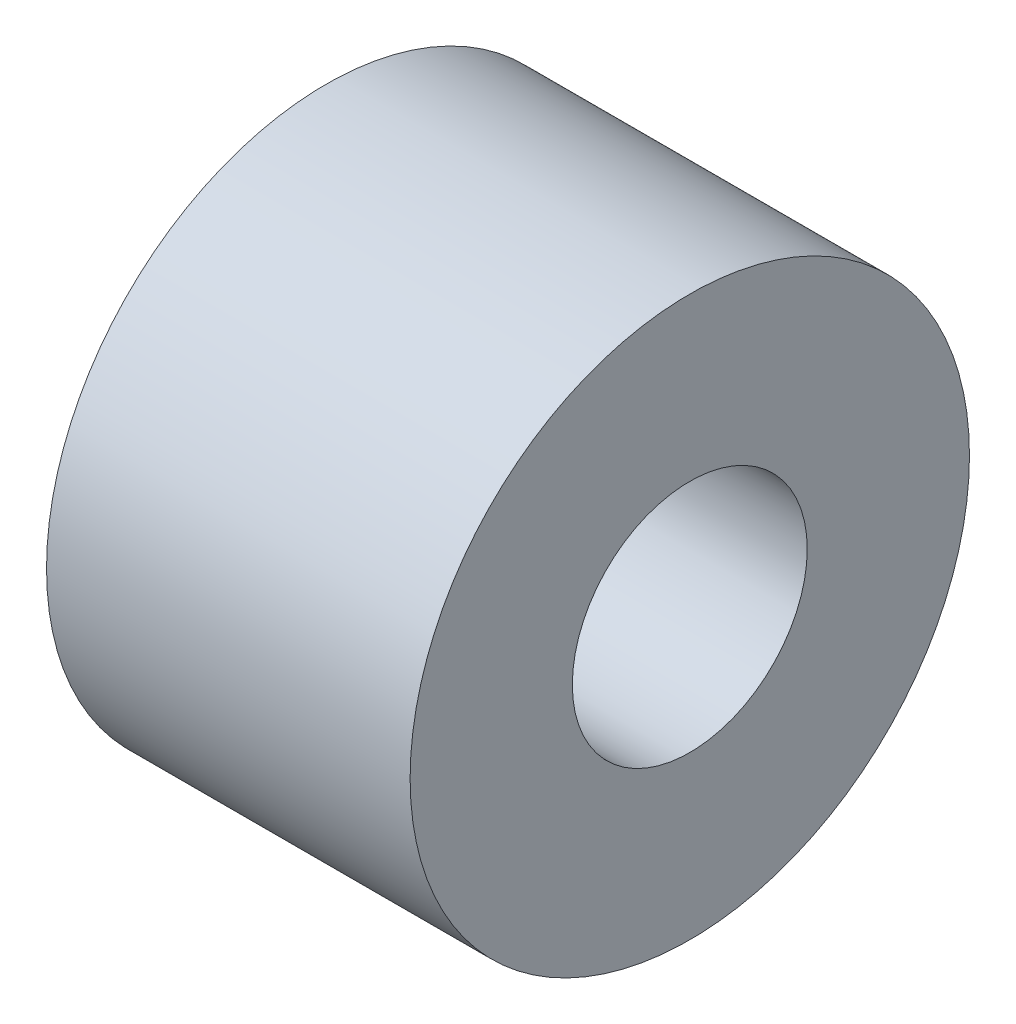
ISO-10303-21;
HEADER;
FILE_DESCRIPTION(('STEP AP214'),'2;1');
FILE_NAME('part.step','',(''),(''),'','','');
FILE_SCHEMA(('AUTOMOTIVE_DESIGN { 1 0 10303 214 1 1 1 1 }'));
ENDSEC;
DATA;
#1=APPLICATION_CONTEXT('core data for automotive mechanical design processes');
#2=APPLICATION_PROTOCOL_DEFINITION('international standard','automotive_design',2000,#1);
#3=PRODUCT_CONTEXT('',#1,'mechanical');
#4=PRODUCT('Part','Part','',(#3));
#5=PRODUCT_RELATED_PRODUCT_CATEGORY('part','',(#4));
#6=PRODUCT_DEFINITION_FORMATION('','',#4);
#7=PRODUCT_DEFINITION_CONTEXT('part definition',#1,'design');
#8=PRODUCT_DEFINITION('design','',#6,#7);
#9=PRODUCT_DEFINITION_SHAPE('','',#8);
#10=(LENGTH_UNIT() NAMED_UNIT(*) SI_UNIT(.MILLI.,.METRE.));
#11=(NAMED_UNIT(*) PLANE_ANGLE_UNIT() SI_UNIT($,.RADIAN.));
#12=(NAMED_UNIT(*) SI_UNIT($,.STERADIAN.) SOLID_ANGLE_UNIT());
#13=UNCERTAINTY_MEASURE_WITH_UNIT(LENGTH_MEASURE(1.E-05),#10,'distance_accuracy_value','');
#14=(GEOMETRIC_REPRESENTATION_CONTEXT(3) GLOBAL_UNCERTAINTY_ASSIGNED_CONTEXT((#13)) GLOBAL_UNIT_ASSIGNED_CONTEXT((#10,
#11,#12)) REPRESENTATION_CONTEXT('',''));
#15=CARTESIAN_POINT('',(0.,0.,0.));
#16=DIRECTION('',(0.,0.,1.));
#17=DIRECTION('',(1.,0.,0.));
#18=AXIS2_PLACEMENT_3D('',#15,#16,#17);
#19=CARTESIAN_POINT('',(13.,0.,0.));
#20=DIRECTION('',(1.,0.,0.));
#21=DIRECTION('',(0.,0.,-1.));
#22=AXIS2_PLACEMENT_3D('',#19,#20,#21);
#23=PLANE('',#22);
#24=CARTESIAN_POINT('',(13.,0.,0.));
#25=DIRECTION('',(1.,0.,0.));
#26=DIRECTION('',(0.,0.,-1.));
#27=AXIS2_PLACEMENT_3D('',#24,#25,#26);
#28=CIRCLE('',#27,10.);
#29=CARTESIAN_POINT('',(13.,0.,10.));
#30=VERTEX_POINT('',#29);
#31=EDGE_CURVE('E10',#30,#30,#28,.T.);
#32=ORIENTED_EDGE('',*,*,#31,.T.);
#33=EDGE_LOOP('',(#32));
#34=FACE_BOUND('',#33,.T.);
#35=CARTESIAN_POINT('',(13.,0.,0.));
#36=DIRECTION('',(1.,0.,0.));
#37=DIRECTION('',(0.,0.,-1.));
#38=AXIS2_PLACEMENT_3D('',#35,#36,#37);
#39=CIRCLE('',#38,4.2);
#40=CARTESIAN_POINT('',(13.,0.,4.2));
#41=VERTEX_POINT('',#40);
#42=EDGE_CURVE('E42',#41,#41,#39,.T.);
#43=ORIENTED_EDGE('',*,*,#42,.F.);
#44=EDGE_LOOP('',(#43));
#45=FACE_BOUND('',#44,.T.);
#46=ADVANCED_FACE('F31',(#34,#45),#23,.T.);
#47=CARTESIAN_POINT('',(0.,0.,0.));
#48=DIRECTION('',(1.,0.,0.));
#49=DIRECTION('',(0.,0.,-1.));
#50=AXIS2_PLACEMENT_3D('',#47,#48,#49);
#51=PLANE('',#50);
#52=CARTESIAN_POINT('',(0.,0.,0.));
#53=DIRECTION('',(1.,0.,0.));
#54=DIRECTION('',(0.,0.,-1.));
#55=AXIS2_PLACEMENT_3D('',#52,#53,#54);
#56=CIRCLE('',#55,10.);
#57=CARTESIAN_POINT('',(0.,0.,10.));
#58=VERTEX_POINT('',#57);
#59=EDGE_CURVE('E35',#58,#58,#56,.T.);
#60=ORIENTED_EDGE('',*,*,#59,.F.);
#61=EDGE_LOOP('',(#60));
#62=FACE_BOUND('',#61,.T.);
#63=CARTESIAN_POINT('',(0.,0.,0.));
#64=DIRECTION('',(1.,0.,0.));
#65=DIRECTION('',(0.,0.,-1.));
#66=AXIS2_PLACEMENT_3D('',#63,#64,#65);
#67=CIRCLE('',#66,4.2);
#68=CARTESIAN_POINT('',(0.,0.,4.2));
#69=VERTEX_POINT('',#68);
#70=EDGE_CURVE('E44',#69,#69,#67,.T.);
#71=ORIENTED_EDGE('',*,*,#70,.T.);
#72=EDGE_LOOP('',(#71));
#73=FACE_BOUND('',#72,.T.);
#74=ADVANCED_FACE('F54',(#62,#73),#51,.F.);
#75=CARTESIAN_POINT('',(13.,0.,0.));
#76=DIRECTION('',(-1.,0.,0.));
#77=DIRECTION('',(0.,0.,1.));
#78=AXIS2_PLACEMENT_3D('',#75,#76,#77);
#79=CYLINDRICAL_SURFACE('',#78,10.);
#80=CARTESIAN_POINT('',(13.,0.,10.));
#81=CARTESIAN_POINT('',(12.8645833333333,0.,10.));
#82=CARTESIAN_POINT('',(12.7291666666667,0.,10.));
#83=CARTESIAN_POINT('',(12.4583333333333,0.,10.));
#84=CARTESIAN_POINT('',(12.3229166666667,0.,10.));
#85=CARTESIAN_POINT('',(12.0520833333333,0.,10.));
#86=CARTESIAN_POINT('',(11.9166666666667,0.,10.));
#87=CARTESIAN_POINT('',(11.6458333333333,0.,10.));
#88=CARTESIAN_POINT('',(11.5104166666667,0.,10.));
#89=CARTESIAN_POINT('',(11.2395833333333,0.,10.));
#90=CARTESIAN_POINT('',(11.1041666666667,0.,10.));
#91=CARTESIAN_POINT('',(10.8333333333333,0.,10.));
#92=CARTESIAN_POINT('',(10.6979166666667,0.,10.));
#93=CARTESIAN_POINT('',(10.4270833333333,0.,10.));
#94=CARTESIAN_POINT('',(10.2916666666667,0.,10.));
#95=CARTESIAN_POINT('',(10.0208333333333,0.,10.));
#96=CARTESIAN_POINT('',(9.88541666666667,0.,10.));
#97=CARTESIAN_POINT('',(9.61458333333333,0.,10.));
#98=CARTESIAN_POINT('',(9.47916666666667,0.,10.));
#99=CARTESIAN_POINT('',(9.20833333333333,0.,10.));
#100=CARTESIAN_POINT('',(9.07291666666666,0.,10.));
#101=CARTESIAN_POINT('',(8.80208333333333,0.,10.));
#102=CARTESIAN_POINT('',(8.66666666666667,0.,10.));
#103=CARTESIAN_POINT('',(8.39583333333333,0.,10.));
#104=CARTESIAN_POINT('',(8.26041666666667,0.,10.));
#105=CARTESIAN_POINT('',(7.98958333333333,0.,10.));
#106=CARTESIAN_POINT('',(7.85416666666667,0.,10.));
#107=CARTESIAN_POINT('',(7.58333333333333,0.,10.));
#108=CARTESIAN_POINT('',(7.44791666666667,0.,10.));
#109=CARTESIAN_POINT('',(7.17708333333333,0.,10.));
#110=CARTESIAN_POINT('',(7.04166666666667,0.,10.));
#111=CARTESIAN_POINT('',(6.77083333333333,0.,10.));
#112=CARTESIAN_POINT('',(6.63541666666667,0.,10.));
#113=CARTESIAN_POINT('',(6.36458333333333,0.,10.));
#114=CARTESIAN_POINT('',(6.22916666666667,0.,10.));
#115=CARTESIAN_POINT('',(5.95833333333333,0.,10.));
#116=CARTESIAN_POINT('',(5.82291666666667,0.,10.));
#117=CARTESIAN_POINT('',(5.55208333333333,0.,10.));
#118=CARTESIAN_POINT('',(5.41666666666667,0.,10.));
#119=CARTESIAN_POINT('',(5.14583333333333,0.,10.));
#120=CARTESIAN_POINT('',(5.01041666666667,0.,10.));
#121=CARTESIAN_POINT('',(4.73958333333333,0.,10.));
#122=CARTESIAN_POINT('',(4.60416666666667,0.,10.));
#123=CARTESIAN_POINT('',(4.33333333333333,0.,10.));
#124=CARTESIAN_POINT('',(4.19791666666667,0.,10.));
#125=CARTESIAN_POINT('',(3.92708333333333,0.,10.));
#126=CARTESIAN_POINT('',(3.79166666666667,0.,10.));
#127=CARTESIAN_POINT('',(3.52083333333333,0.,10.));
#128=CARTESIAN_POINT('',(3.38541666666667,0.,10.));
#129=CARTESIAN_POINT('',(3.11458333333333,0.,10.));
#130=CARTESIAN_POINT('',(2.97916666666667,0.,10.));
#131=CARTESIAN_POINT('',(2.70833333333333,0.,10.));
#132=CARTESIAN_POINT('',(2.57291666666667,0.,10.));
#133=CARTESIAN_POINT('',(2.30208333333333,0.,10.));
#134=CARTESIAN_POINT('',(2.16666666666667,0.,10.));
#135=CARTESIAN_POINT('',(1.89583333333333,0.,10.));
#136=CARTESIAN_POINT('',(1.76041666666667,0.,10.));
#137=CARTESIAN_POINT('',(1.48958333333333,0.,10.));
#138=CARTESIAN_POINT('',(1.35416666666667,0.,10.));
#139=CARTESIAN_POINT('',(1.08333333333333,0.,10.));
#140=CARTESIAN_POINT('',(0.947916666666667,0.,10.));
#141=CARTESIAN_POINT('',(0.677083333333334,0.,10.));
#142=CARTESIAN_POINT('',(0.541666666666667,0.,10.));
#143=CARTESIAN_POINT('',(0.270833333333334,0.,10.));
#144=CARTESIAN_POINT('',(0.135416666666667,0.,10.));
#145=CARTESIAN_POINT('',(0.,0.,10.));
#146=B_SPLINE_CURVE_WITH_KNOTS('',3,(#80,#81,#82,#83,#84,#85,#86,#87,#88,#89,#90,#91,#92,#93,
#94,#95,#96,#97,#98,#99,#100,#101,#102,#103,#104,#105,#106,#107,#108,#109,#110,#111,#112,#113,
#114,#115,#116,#117,#118,#119,#120,#121,#122,#123,#124,#125,#126,#127,#128,#129,#130,#131,#132,
#133,#134,#135,#136,#137,#138,#139,#140,#141,#142,#143,#144,#145),.UNSPECIFIED.,.F.,.F.,(4,2,2,
2,2,2,2,2,2,2,2,2,2,2,2,2,2,2,2,2,2,2,2,2,2,2,2,2,2,2,2,2,4),(0.,0.40625,0.812500000000001,
1.21875,1.625,2.03125,2.4375,2.84375,3.25,3.65625,4.0625,4.46875,4.875,5.28125,5.6875,6.09375,
6.5,6.90625,7.3125,7.71875,8.125,8.53125,8.9375,9.34375,9.75,10.15625,10.5625,10.96875,11.375,
11.78125,12.1875,12.59375,13.),.UNSPECIFIED.);
#147=EDGE_CURVE('BSEAM33',#30,#58,#146,.T.);
#148=ORIENTED_EDGE('',*,*,#31,.F.);
#149=ORIENTED_EDGE('',*,*,#59,.T.);
#150=ORIENTED_EDGE('',*,*,#147,.T.);
#151=ORIENTED_EDGE('',*,*,#147,.F.);
#152=EDGE_LOOP('',(#148,#150,#149,#151));
#153=FACE_BOUND('',#152,.T.);
#154=ADVANCED_FACE('F33',(#153),#79,.T.);
#155=CARTESIAN_POINT('',(13.,0.,0.));
#156=DIRECTION('',(-1.,0.,0.));
#157=DIRECTION('',(0.,0.,1.));
#158=AXIS2_PLACEMENT_3D('',#155,#156,#157);
#159=CYLINDRICAL_SURFACE('',#158,4.2);
#160=CARTESIAN_POINT('',(13.,0.,4.2));
#161=CARTESIAN_POINT('',(12.8645833333333,0.,4.2));
#162=CARTESIAN_POINT('',(12.7291666666667,0.,4.2));
#163=CARTESIAN_POINT('',(12.4583333333333,0.,4.2));
#164=CARTESIAN_POINT('',(12.3229166666667,0.,4.2));
#165=CARTESIAN_POINT('',(12.0520833333333,0.,4.2));
#166=CARTESIAN_POINT('',(11.9166666666667,0.,4.2));
#167=CARTESIAN_POINT('',(11.6458333333333,0.,4.2));
#168=CARTESIAN_POINT('',(11.5104166666667,0.,4.2));
#169=CARTESIAN_POINT('',(11.2395833333333,0.,4.2));
#170=CARTESIAN_POINT('',(11.1041666666667,0.,4.2));
#171=CARTESIAN_POINT('',(10.8333333333333,0.,4.2));
#172=CARTESIAN_POINT('',(10.6979166666667,0.,4.2));
#173=CARTESIAN_POINT('',(10.4270833333333,0.,4.2));
#174=CARTESIAN_POINT('',(10.2916666666667,0.,4.2));
#175=CARTESIAN_POINT('',(10.0208333333333,0.,4.2));
#176=CARTESIAN_POINT('',(9.88541666666667,0.,4.2));
#177=CARTESIAN_POINT('',(9.61458333333333,0.,4.2));
#178=CARTESIAN_POINT('',(9.47916666666667,0.,4.2));
#179=CARTESIAN_POINT('',(9.20833333333333,0.,4.2));
#180=CARTESIAN_POINT('',(9.07291666666666,0.,4.2));
#181=CARTESIAN_POINT('',(8.80208333333333,0.,4.2));
#182=CARTESIAN_POINT('',(8.66666666666667,0.,4.2));
#183=CARTESIAN_POINT('',(8.39583333333333,0.,4.2));
#184=CARTESIAN_POINT('',(8.26041666666667,0.,4.2));
#185=CARTESIAN_POINT('',(7.98958333333333,0.,4.2));
#186=CARTESIAN_POINT('',(7.85416666666667,0.,4.2));
#187=CARTESIAN_POINT('',(7.58333333333333,0.,4.2));
#188=CARTESIAN_POINT('',(7.44791666666667,0.,4.2));
#189=CARTESIAN_POINT('',(7.17708333333333,0.,4.2));
#190=CARTESIAN_POINT('',(7.04166666666667,0.,4.2));
#191=CARTESIAN_POINT('',(6.77083333333333,0.,4.2));
#192=CARTESIAN_POINT('',(6.63541666666667,0.,4.2));
#193=CARTESIAN_POINT('',(6.36458333333333,0.,4.2));
#194=CARTESIAN_POINT('',(6.22916666666667,0.,4.2));
#195=CARTESIAN_POINT('',(5.95833333333333,0.,4.2));
#196=CARTESIAN_POINT('',(5.82291666666667,0.,4.2));
#197=CARTESIAN_POINT('',(5.55208333333333,0.,4.2));
#198=CARTESIAN_POINT('',(5.41666666666667,0.,4.2));
#199=CARTESIAN_POINT('',(5.14583333333333,0.,4.2));
#200=CARTESIAN_POINT('',(5.01041666666667,0.,4.2));
#201=CARTESIAN_POINT('',(4.73958333333333,0.,4.2));
#202=CARTESIAN_POINT('',(4.60416666666667,0.,4.2));
#203=CARTESIAN_POINT('',(4.33333333333333,0.,4.2));
#204=CARTESIAN_POINT('',(4.19791666666667,0.,4.2));
#205=CARTESIAN_POINT('',(3.92708333333333,0.,4.2));
#206=CARTESIAN_POINT('',(3.79166666666667,0.,4.2));
#207=CARTESIAN_POINT('',(3.52083333333333,0.,4.2));
#208=CARTESIAN_POINT('',(3.38541666666667,0.,4.2));
#209=CARTESIAN_POINT('',(3.11458333333333,0.,4.2));
#210=CARTESIAN_POINT('',(2.97916666666667,0.,4.2));
#211=CARTESIAN_POINT('',(2.70833333333333,0.,4.2));
#212=CARTESIAN_POINT('',(2.57291666666667,0.,4.2));
#213=CARTESIAN_POINT('',(2.30208333333333,0.,4.2));
#214=CARTESIAN_POINT('',(2.16666666666667,0.,4.2));
#215=CARTESIAN_POINT('',(1.89583333333333,0.,4.2));
#216=CARTESIAN_POINT('',(1.76041666666667,0.,4.2));
#217=CARTESIAN_POINT('',(1.48958333333333,0.,4.2));
#218=CARTESIAN_POINT('',(1.35416666666667,0.,4.2));
#219=CARTESIAN_POINT('',(1.08333333333333,0.,4.2));
#220=CARTESIAN_POINT('',(0.947916666666667,0.,4.2));
#221=CARTESIAN_POINT('',(0.677083333333334,0.,4.2));
#222=CARTESIAN_POINT('',(0.541666666666667,0.,4.2));
#223=CARTESIAN_POINT('',(0.270833333333334,0.,4.2));
#224=CARTESIAN_POINT('',(0.135416666666667,0.,4.2));
#225=CARTESIAN_POINT('',(0.,0.,4.2));
#226=B_SPLINE_CURVE_WITH_KNOTS('',3,(#160,#161,#162,#163,#164,#165,#166,#167,#168,#169,#170,
#171,#172,#173,#174,#175,#176,#177,#178,#179,#180,#181,#182,#183,#184,#185,#186,#187,#188,#189,
#190,#191,#192,#193,#194,#195,#196,#197,#198,#199,#200,#201,#202,#203,#204,#205,#206,#207,#208,
#209,#210,#211,#212,#213,#214,#215,#216,#217,#218,#219,#220,#221,#222,#223,#224,#225),
.UNSPECIFIED.,.F.,.F.,(4,2,2,2,2,2,2,2,2,2,2,2,2,2,2,2,2,2,2,2,2,2,2,2,2,2,2,2,2,2,2,2,4),(0.,
0.40625,0.812500000000001,1.21875,1.625,2.03125,2.4375,2.84375,3.25,3.65625,4.0625,4.46875,
4.875,5.28125,5.6875,6.09375,6.5,6.90625,7.3125,7.71875,8.125,8.53125,8.9375,9.34375,9.75,
10.15625,10.5625,10.96875,11.375,11.78125,12.1875,12.59375,13.),.UNSPECIFIED.);
#227=EDGE_CURVE('BSEAM50',#41,#69,#226,.T.);
#228=ORIENTED_EDGE('',*,*,#42,.T.);
#229=ORIENTED_EDGE('',*,*,#70,.F.);
#230=ORIENTED_EDGE('',*,*,#227,.T.);
#231=ORIENTED_EDGE('',*,*,#227,.F.);
#232=EDGE_LOOP('',(#228,#230,#229,#231));
#233=FACE_BOUND('',#232,.T.);
#234=ADVANCED_FACE('F50',(#233),#159,.F.);
#235=CLOSED_SHELL('',(#46,#74,#154,#234));
#236=MANIFOLD_SOLID_BREP('B2',#235);
#237=ADVANCED_BREP_SHAPE_REPRESENTATION('',(#18,#236),#14);
#238=SHAPE_DEFINITION_REPRESENTATION(#9,#237);
ENDSEC;
END-ISO-10303-21;
